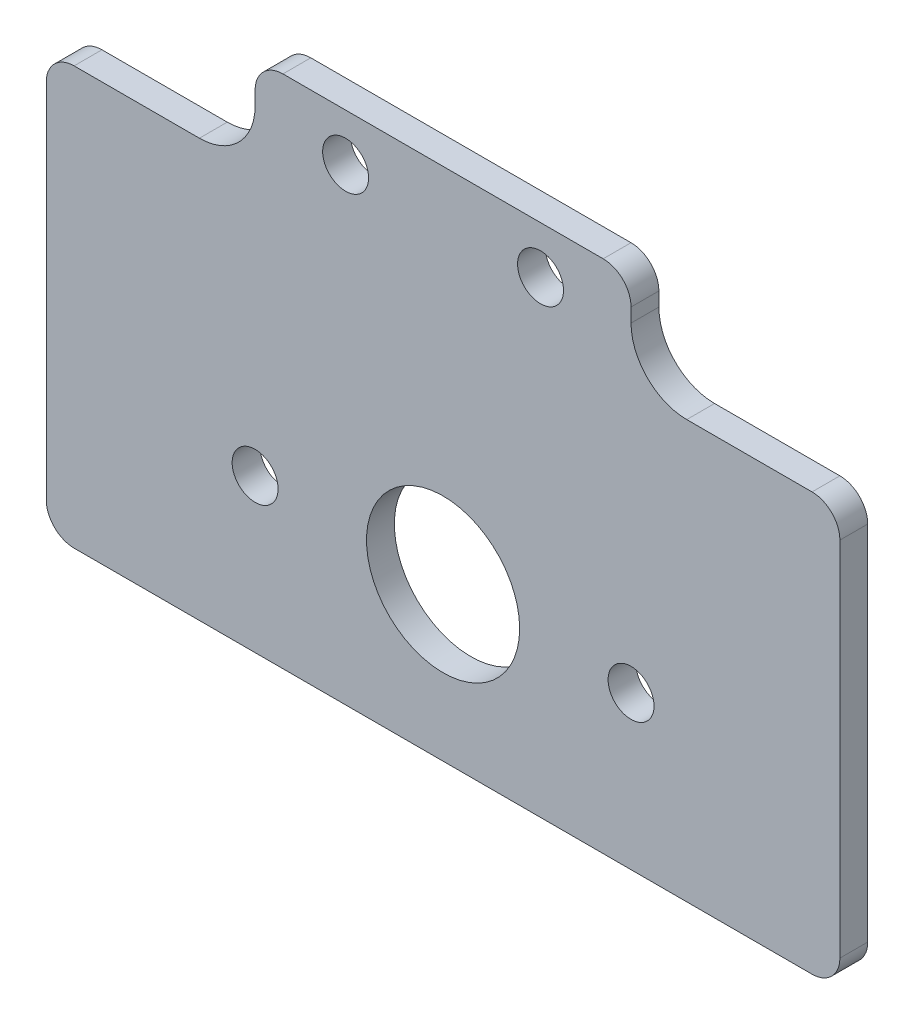
ISO-10303-21;
HEADER;
FILE_DESCRIPTION(('STEP AP214'),'2;1');
FILE_NAME('part.step','',(''),(''),'','','');
FILE_SCHEMA(('AUTOMOTIVE_DESIGN { 1 0 10303 214 1 1 1 1 }'));
ENDSEC;
DATA;
#1=APPLICATION_CONTEXT('core data for automotive mechanical design processes');
#2=APPLICATION_PROTOCOL_DEFINITION('international standard','automotive_design',2000,#1);
#3=PRODUCT_CONTEXT('',#1,'mechanical');
#4=PRODUCT('Part','Part','',(#3));
#5=PRODUCT_RELATED_PRODUCT_CATEGORY('part','',(#4));
#6=PRODUCT_DEFINITION_FORMATION('','',#4);
#7=PRODUCT_DEFINITION_CONTEXT('part definition',#1,'design');
#8=PRODUCT_DEFINITION('design','',#6,#7);
#9=PRODUCT_DEFINITION_SHAPE('','',#8);
#10=(LENGTH_UNIT() NAMED_UNIT(*) SI_UNIT(.MILLI.,.METRE.));
#11=(NAMED_UNIT(*) PLANE_ANGLE_UNIT() SI_UNIT($,.RADIAN.));
#12=(NAMED_UNIT(*) SI_UNIT($,.STERADIAN.) SOLID_ANGLE_UNIT());
#13=UNCERTAINTY_MEASURE_WITH_UNIT(LENGTH_MEASURE(1.E-05),#10,'distance_accuracy_value','');
#14=(GEOMETRIC_REPRESENTATION_CONTEXT(3) GLOBAL_UNCERTAINTY_ASSIGNED_CONTEXT((#13)) GLOBAL_UNIT_ASSIGNED_CONTEXT((#10,
#11,#12)) REPRESENTATION_CONTEXT('',''));
#15=CARTESIAN_POINT('',(0.,0.,0.));
#16=DIRECTION('',(0.,0.,1.));
#17=DIRECTION('',(1.,0.,0.));
#18=AXIS2_PLACEMENT_3D('',#15,#16,#17);
#19=CARTESIAN_POINT('',(142.5,86.9148936170212,10.));
#20=DIRECTION('',(0.,0.,1.));
#21=DIRECTION('',(1.,0.,0.));
#22=AXIS2_PLACEMENT_3D('',#19,#20,#21);
#23=PLANE('',#22);
#24=CARTESIAN_POINT('',(210.,55.,10.));
#25=DIRECTION('',(0.,0.,1.));
#26=DIRECTION('',(1.,0.,0.));
#27=AXIS2_PLACEMENT_3D('',#24,#25,#26);
#28=CIRCLE('',#27,8.25);
#29=CARTESIAN_POINT('',(218.25,55.,10.));
#30=VERTEX_POINT('',#29);
#31=EDGE_CURVE('E222',#30,#30,#28,.F.);
#32=ORIENTED_EDGE('',*,*,#31,.T.);
#33=EDGE_LOOP('',(#32));
#34=FACE_BOUND('',#33,.T.);
#35=CARTESIAN_POINT('',(177.5,168.,10.));
#36=DIRECTION('',(0.,0.,1.));
#37=DIRECTION('',(1.,0.,0.));
#38=AXIS2_PLACEMENT_3D('',#35,#36,#37);
#39=CIRCLE('',#38,8.25);
#40=CARTESIAN_POINT('',(185.75,168.,10.));
#41=VERTEX_POINT('',#40);
#42=EDGE_CURVE('E225',#41,#41,#39,.F.);
#43=ORIENTED_EDGE('',*,*,#42,.T.);
#44=EDGE_LOOP('',(#43));
#45=FACE_BOUND('',#44,.T.);
#46=CARTESIAN_POINT('',(107.5,168.,10.));
#47=DIRECTION('',(0.,0.,1.));
#48=DIRECTION('',(1.,0.,0.));
#49=AXIS2_PLACEMENT_3D('',#46,#47,#48);
#50=CIRCLE('',#49,8.25);
#51=CARTESIAN_POINT('',(115.75,168.,10.));
#52=VERTEX_POINT('',#51);
#53=EDGE_CURVE('E228',#52,#52,#50,.F.);
#54=ORIENTED_EDGE('',*,*,#53,.T.);
#55=EDGE_LOOP('',(#54));
#56=FACE_BOUND('',#55,.T.);
#57=CARTESIAN_POINT('',(75.,55.,10.));
#58=DIRECTION('',(0.,0.,1.));
#59=DIRECTION('',(1.,0.,0.));
#60=AXIS2_PLACEMENT_3D('',#57,#58,#59);
#61=CIRCLE('',#60,8.25);
#62=CARTESIAN_POINT('',(83.25,55.,10.));
#63=VERTEX_POINT('',#62);
#64=EDGE_CURVE('E231',#63,#63,#61,.F.);
#65=ORIENTED_EDGE('',*,*,#64,.T.);
#66=EDGE_LOOP('',(#65));
#67=FACE_BOUND('',#66,.T.);
#68=CARTESIAN_POINT('',(142.5,55.,10.));
#69=DIRECTION('',(0.,0.,1.));
#70=DIRECTION('',(1.,0.,0.));
#71=AXIS2_PLACEMENT_3D('',#68,#69,#70);
#72=CIRCLE('',#71,27.5);
#73=CARTESIAN_POINT('',(170.,55.,10.));
#74=VERTEX_POINT('',#73);
#75=EDGE_CURVE('E234',#74,#74,#72,.F.);
#76=ORIENTED_EDGE('',*,*,#75,.T.);
#77=EDGE_LOOP('',(#76));
#78=FACE_BOUND('',#77,.T.);
#79=CARTESIAN_POINT('',(10.,140.,10.));
#80=DIRECTION('',(0.,0.,1.));
#81=DIRECTION('',(1.,0.,0.));
#82=AXIS2_PLACEMENT_3D('',#79,#80,#81);
#83=CIRCLE('',#82,10.);
#84=CARTESIAN_POINT('',(0.,140.,10.));
#85=VERTEX_POINT('',#84);
#86=CARTESIAN_POINT('',(10.,150.,10.));
#87=VERTEX_POINT('',#86);
#88=EDGE_CURVE('E239',#85,#87,#83,.F.);
#89=ORIENTED_EDGE('',*,*,#88,.F.);
#90=DIRECTION('',(0.,1.,0.));
#91=VECTOR('',#90,1.);
#92=CARTESIAN_POINT('',(0.,150.,10.));
#93=LINE('',#92,#91);
#94=CARTESIAN_POINT('',(0.,10.,10.));
#95=VERTEX_POINT('',#94);
#96=EDGE_CURVE('E154',#95,#85,#93,.T.);
#97=ORIENTED_EDGE('',*,*,#96,.F.);
#98=CARTESIAN_POINT('',(10.,10.,10.));
#99=DIRECTION('',(0.,0.,1.));
#100=DIRECTION('',(1.,0.,0.));
#101=AXIS2_PLACEMENT_3D('',#98,#99,#100);
#102=CIRCLE('',#101,10.);
#103=CARTESIAN_POINT('',(10.,0.,10.));
#104=VERTEX_POINT('',#103);
#105=EDGE_CURVE('E141',#104,#95,#102,.F.);
#106=ORIENTED_EDGE('',*,*,#105,.F.);
#107=DIRECTION('',(1.,0.,0.));
#108=VECTOR('',#107,1.);
#109=CARTESIAN_POINT('',(0.,0.,10.));
#110=LINE('',#109,#108);
#111=CARTESIAN_POINT('',(275.,0.,10.));
#112=VERTEX_POINT('',#111);
#113=EDGE_CURVE('E137',#112,#104,#110,.F.);
#114=ORIENTED_EDGE('',*,*,#113,.F.);
#115=CARTESIAN_POINT('',(275.,10.,10.));
#116=DIRECTION('',(0.,0.,1.));
#117=DIRECTION('',(1.,0.,0.));
#118=AXIS2_PLACEMENT_3D('',#115,#116,#117);
#119=CIRCLE('',#118,10.);
#120=CARTESIAN_POINT('',(285.,10.,10.));
#121=VERTEX_POINT('',#120);
#122=EDGE_CURVE('E20',#121,#112,#119,.F.);
#123=ORIENTED_EDGE('',*,*,#122,.F.);
#124=DIRECTION('',(0.,1.,0.));
#125=VECTOR('',#124,1.);
#126=CARTESIAN_POINT('',(285.,0.,10.));
#127=LINE('',#126,#125);
#128=CARTESIAN_POINT('',(285.,140.,10.));
#129=VERTEX_POINT('',#128);
#130=EDGE_CURVE('E150',#129,#121,#127,.F.);
#131=ORIENTED_EDGE('',*,*,#130,.F.);
#132=CARTESIAN_POINT('',(275.,140.,10.));
#133=DIRECTION('',(0.,0.,1.));
#134=DIRECTION('',(1.,0.,0.));
#135=AXIS2_PLACEMENT_3D('',#132,#133,#134);
#136=CIRCLE('',#135,10.);
#137=CARTESIAN_POINT('',(275.,150.,10.));
#138=VERTEX_POINT('',#137);
#139=EDGE_CURVE('E180',#138,#129,#136,.F.);
#140=ORIENTED_EDGE('',*,*,#139,.F.);
#141=DIRECTION('',(-1.,0.,0.));
#142=VECTOR('',#141,1.);
#143=CARTESIAN_POINT('',(285.,150.,10.));
#144=LINE('',#143,#142);
#145=CARTESIAN_POINT('',(230.,150.,10.));
#146=VERTEX_POINT('',#145);
#147=EDGE_CURVE('E175',#146,#138,#144,.F.);
#148=ORIENTED_EDGE('',*,*,#147,.F.);
#149=CARTESIAN_POINT('',(230.,170.,10.));
#150=DIRECTION('',(0.,0.,1.));
#151=DIRECTION('',(1.,0.,0.));
#152=AXIS2_PLACEMENT_3D('',#149,#150,#151);
#153=CIRCLE('',#152,20.);
#154=CARTESIAN_POINT('',(210.,170.,10.));
#155=VERTEX_POINT('',#154);
#156=EDGE_CURVE('E174',#146,#155,#153,.F.);
#157=ORIENTED_EDGE('',*,*,#156,.T.);
#158=DIRECTION('',(0.,1.,0.));
#159=VECTOR('',#158,1.);
#160=CARTESIAN_POINT('',(210.,150.,10.));
#161=LINE('',#160,#159);
#162=CARTESIAN_POINT('',(210.,175.,10.));
#163=VERTEX_POINT('',#162);
#164=EDGE_CURVE('E171',#163,#155,#161,.F.);
#165=ORIENTED_EDGE('',*,*,#164,.F.);
#166=CARTESIAN_POINT('',(200.,175.,10.));
#167=DIRECTION('',(0.,0.,1.));
#168=DIRECTION('',(1.,0.,0.));
#169=AXIS2_PLACEMENT_3D('',#166,#167,#168);
#170=CIRCLE('',#169,10.);
#171=CARTESIAN_POINT('',(200.,185.,10.));
#172=VERTEX_POINT('',#171);
#173=EDGE_CURVE('E246',#172,#163,#170,.F.);
#174=ORIENTED_EDGE('',*,*,#173,.F.);
#175=DIRECTION('',(-1.,0.,0.));
#176=VECTOR('',#175,1.);
#177=CARTESIAN_POINT('',(210.,185.,10.));
#178=LINE('',#177,#176);
#179=CARTESIAN_POINT('',(85.,185.,10.));
#180=VERTEX_POINT('',#179);
#181=EDGE_CURVE('E167',#180,#172,#178,.F.);
#182=ORIENTED_EDGE('',*,*,#181,.F.);
#183=CARTESIAN_POINT('',(85.,175.,10.));
#184=DIRECTION('',(0.,0.,1.));
#185=DIRECTION('',(1.,0.,0.));
#186=AXIS2_PLACEMENT_3D('',#183,#184,#185);
#187=CIRCLE('',#186,10.);
#188=CARTESIAN_POINT('',(75.,175.,10.));
#189=VERTEX_POINT('',#188);
#190=EDGE_CURVE('E243',#189,#180,#187,.F.);
#191=ORIENTED_EDGE('',*,*,#190,.F.);
#192=DIRECTION('',(0.,-1.,0.));
#193=VECTOR('',#192,1.);
#194=CARTESIAN_POINT('',(75.,185.,10.));
#195=LINE('',#194,#193);
#196=CARTESIAN_POINT('',(75.,170.,10.));
#197=VERTEX_POINT('',#196);
#198=EDGE_CURVE('E162',#197,#189,#195,.F.);
#199=ORIENTED_EDGE('',*,*,#198,.F.);
#200=CARTESIAN_POINT('',(55.,170.,10.));
#201=DIRECTION('',(0.,0.,1.));
#202=DIRECTION('',(1.,0.,0.));
#203=AXIS2_PLACEMENT_3D('',#200,#201,#202);
#204=CIRCLE('',#203,20.);
#205=CARTESIAN_POINT('',(55.,150.,10.));
#206=VERTEX_POINT('',#205);
#207=EDGE_CURVE('E161',#197,#206,#204,.F.);
#208=ORIENTED_EDGE('',*,*,#207,.T.);
#209=DIRECTION('',(-1.,0.,0.));
#210=VECTOR('',#209,1.);
#211=CARTESIAN_POINT('',(75.,150.,10.));
#212=LINE('',#211,#210);
#213=EDGE_CURVE('E158',#87,#206,#212,.F.);
#214=ORIENTED_EDGE('',*,*,#213,.F.);
#215=EDGE_LOOP('',(#89,#97,#106,#114,#123,#131,#140,#148,#157,#165,#174,#182,#191,#199,#208,#214));
#216=FACE_BOUND('',#215,.T.);
#217=ADVANCED_FACE('F17',(#34,#45,#56,#67,#78,#216),#23,.T.);
#218=CARTESIAN_POINT('',(0.,0.,0.));
#219=DIRECTION('',(0.,-1.,0.));
#220=DIRECTION('',(0.,0.,-1.));
#221=AXIS2_PLACEMENT_3D('',#218,#219,#220);
#222=PLANE('',#221);
#223=DIRECTION('',(0.,0.,1.));
#224=VECTOR('',#223,1.);
#225=CARTESIAN_POINT('',(275.,0.,0.));
#226=LINE('',#225,#224);
#227=CARTESIAN_POINT('',(275.,0.,0.));
#228=VERTEX_POINT('',#227);
#229=EDGE_CURVE('E134',#112,#228,#226,.F.);
#230=ORIENTED_EDGE('',*,*,#229,.F.);
#231=ORIENTED_EDGE('',*,*,#113,.T.);
#232=DIRECTION('',(0.,0.,1.));
#233=VECTOR('',#232,1.);
#234=CARTESIAN_POINT('',(10.,0.,0.));
#235=LINE('',#234,#233);
#236=CARTESIAN_POINT('',(10.,0.,0.));
#237=VERTEX_POINT('',#236);
#238=EDGE_CURVE('E237',#237,#104,#235,.T.);
#239=ORIENTED_EDGE('',*,*,#238,.F.);
#240=DIRECTION('',(1.,0.,0.));
#241=VECTOR('',#240,1.);
#242=CARTESIAN_POINT('',(142.5,0.,0.));
#243=LINE('',#242,#241);
#244=EDGE_CURVE('E148',#237,#228,#243,.T.);
#245=ORIENTED_EDGE('',*,*,#244,.T.);
#246=EDGE_LOOP('',(#230,#231,#239,#245));
#247=FACE_BOUND('',#246,.T.);
#248=ADVANCED_FACE('F147',(#247),#222,.T.);
#249=CARTESIAN_POINT('',(275.,10.,0.));
#250=DIRECTION('',(0.,0.,1.));
#251=DIRECTION('',(1.,0.,0.));
#252=AXIS2_PLACEMENT_3D('',#249,#250,#251);
#253=CYLINDRICAL_SURFACE('',#252,10.);
#254=CARTESIAN_POINT('',(275.,10.,0.));
#255=DIRECTION('',(0.,0.,1.));
#256=DIRECTION('',(1.,0.,0.));
#257=AXIS2_PLACEMENT_3D('',#254,#255,#256);
#258=CIRCLE('',#257,10.);
#259=CARTESIAN_POINT('',(285.,10.,0.));
#260=VERTEX_POINT('',#259);
#261=EDGE_CURVE('E220',#228,#260,#258,.T.);
#262=ORIENTED_EDGE('',*,*,#261,.T.);
#263=DIRECTION('',(0.,0.,-1.));
#264=VECTOR('',#263,1.);
#265=CARTESIAN_POINT('',(285.,10.,0.));
#266=LINE('',#265,#264);
#267=EDGE_CURVE('E136',#121,#260,#266,.T.);
#268=ORIENTED_EDGE('',*,*,#267,.F.);
#269=ORIENTED_EDGE('',*,*,#122,.T.);
#270=ORIENTED_EDGE('',*,*,#229,.T.);
#271=EDGE_LOOP('',(#262,#268,#269,#270));
#272=FACE_BOUND('',#271,.T.);
#273=ADVANCED_FACE('F132',(#272),#253,.T.);
#274=CARTESIAN_POINT('',(285.,0.,0.));
#275=DIRECTION('',(1.,0.,0.));
#276=DIRECTION('',(0.,0.,-1.));
#277=AXIS2_PLACEMENT_3D('',#274,#275,#276);
#278=PLANE('',#277);
#279=DIRECTION('',(0.,0.,1.));
#280=VECTOR('',#279,1.);
#281=CARTESIAN_POINT('',(285.,140.,0.));
#282=LINE('',#281,#280);
#283=CARTESIAN_POINT('',(285.,140.,0.));
#284=VERTEX_POINT('',#283);
#285=EDGE_CURVE('E249',#129,#284,#282,.F.);
#286=ORIENTED_EDGE('',*,*,#285,.F.);
#287=ORIENTED_EDGE('',*,*,#130,.T.);
#288=ORIENTED_EDGE('',*,*,#267,.T.);
#289=DIRECTION('',(0.,1.,0.));
#290=VECTOR('',#289,1.);
#291=CARTESIAN_POINT('',(285.,86.9148936170212,0.));
#292=LINE('',#291,#290);
#293=EDGE_CURVE('E219',#260,#284,#292,.T.);
#294=ORIENTED_EDGE('',*,*,#293,.T.);
#295=EDGE_LOOP('',(#286,#287,#288,#294));
#296=FACE_BOUND('',#295,.T.);
#297=ADVANCED_FACE('F336',(#296),#278,.T.);
#298=CARTESIAN_POINT('',(275.,140.,0.));
#299=DIRECTION('',(0.,0.,1.));
#300=DIRECTION('',(1.,0.,0.));
#301=AXIS2_PLACEMENT_3D('',#298,#299,#300);
#302=CYLINDRICAL_SURFACE('',#301,10.);
#303=CARTESIAN_POINT('',(275.,140.,0.));
#304=DIRECTION('',(0.,0.,1.));
#305=DIRECTION('',(1.,0.,0.));
#306=AXIS2_PLACEMENT_3D('',#303,#304,#305);
#307=CIRCLE('',#306,10.);
#308=CARTESIAN_POINT('',(275.,150.,0.));
#309=VERTEX_POINT('',#308);
#310=EDGE_CURVE('E216',#284,#309,#307,.T.);
#311=ORIENTED_EDGE('',*,*,#310,.T.);
#312=DIRECTION('',(0.,0.,1.));
#313=VECTOR('',#312,1.);
#314=CARTESIAN_POINT('',(275.,150.,0.));
#315=LINE('',#314,#313);
#316=EDGE_CURVE('E179',#138,#309,#315,.F.);
#317=ORIENTED_EDGE('',*,*,#316,.F.);
#318=ORIENTED_EDGE('',*,*,#139,.T.);
#319=ORIENTED_EDGE('',*,*,#285,.T.);
#320=EDGE_LOOP('',(#311,#317,#318,#319));
#321=FACE_BOUND('',#320,.T.);
#322=ADVANCED_FACE('F334',(#321),#302,.T.);
#323=CARTESIAN_POINT('',(285.,150.,0.));
#324=DIRECTION('',(0.,1.,0.));
#325=DIRECTION('',(-1.,0.,0.));
#326=AXIS2_PLACEMENT_3D('',#323,#324,#325);
#327=PLANE('',#326);
#328=DIRECTION('',(0.,0.,1.));
#329=VECTOR('',#328,1.);
#330=CARTESIAN_POINT('',(230.,150.,0.));
#331=LINE('',#330,#329);
#332=CARTESIAN_POINT('',(230.,150.,0.));
#333=VERTEX_POINT('',#332);
#334=EDGE_CURVE('E178',#333,#146,#331,.T.);
#335=ORIENTED_EDGE('',*,*,#334,.T.);
#336=ORIENTED_EDGE('',*,*,#147,.T.);
#337=ORIENTED_EDGE('',*,*,#316,.T.);
#338=DIRECTION('',(1.,0.,0.));
#339=VECTOR('',#338,1.);
#340=CARTESIAN_POINT('',(142.5,150.,0.));
#341=LINE('',#340,#339);
#342=EDGE_CURVE('E215',#309,#333,#341,.F.);
#343=ORIENTED_EDGE('',*,*,#342,.T.);
#344=EDGE_LOOP('',(#335,#336,#337,#343));
#345=FACE_BOUND('',#344,.T.);
#346=ADVANCED_FACE('F332',(#345),#327,.T.);
#347=CARTESIAN_POINT('',(230.,170.,0.));
#348=DIRECTION('',(0.,0.,1.));
#349=DIRECTION('',(1.,0.,0.));
#350=AXIS2_PLACEMENT_3D('',#347,#348,#349);
#351=CYLINDRICAL_SURFACE('',#350,20.);
#352=DIRECTION('',(0.,0.,-1.));
#353=VECTOR('',#352,1.);
#354=CARTESIAN_POINT('',(210.,170.,0.));
#355=LINE('',#354,#353);
#356=CARTESIAN_POINT('',(210.,170.,0.));
#357=VERTEX_POINT('',#356);
#358=EDGE_CURVE('E173',#155,#357,#355,.T.);
#359=ORIENTED_EDGE('',*,*,#358,.F.);
#360=ORIENTED_EDGE('',*,*,#156,.F.);
#361=ORIENTED_EDGE('',*,*,#334,.F.);
#362=CARTESIAN_POINT('',(230.,170.,0.));
#363=DIRECTION('',(0.,0.,1.));
#364=DIRECTION('',(1.,0.,0.));
#365=AXIS2_PLACEMENT_3D('',#362,#363,#364);
#366=CIRCLE('',#365,20.);
#367=EDGE_CURVE('E212',#333,#357,#366,.F.);
#368=ORIENTED_EDGE('',*,*,#367,.T.);
#369=EDGE_LOOP('',(#359,#360,#361,#368));
#370=FACE_BOUND('',#369,.T.);
#371=ADVANCED_FACE('F329',(#370),#351,.F.);
#372=CARTESIAN_POINT('',(210.,150.,0.));
#373=DIRECTION('',(1.,0.,0.));
#374=DIRECTION('',(0.,0.,-1.));
#375=AXIS2_PLACEMENT_3D('',#372,#373,#374);
#376=PLANE('',#375);
#377=ORIENTED_EDGE('',*,*,#358,.T.);
#378=DIRECTION('',(0.,1.,0.));
#379=VECTOR('',#378,1.);
#380=CARTESIAN_POINT('',(210.,86.9148936170212,0.));
#381=LINE('',#380,#379);
#382=CARTESIAN_POINT('',(210.,175.,0.));
#383=VERTEX_POINT('',#382);
#384=EDGE_CURVE('E211',#357,#383,#381,.T.);
#385=ORIENTED_EDGE('',*,*,#384,.T.);
#386=DIRECTION('',(0.,0.,1.));
#387=VECTOR('',#386,1.);
#388=CARTESIAN_POINT('',(210.,175.,0.));
#389=LINE('',#388,#387);
#390=EDGE_CURVE('E170',#163,#383,#389,.F.);
#391=ORIENTED_EDGE('',*,*,#390,.F.);
#392=ORIENTED_EDGE('',*,*,#164,.T.);
#393=EDGE_LOOP('',(#377,#385,#391,#392));
#394=FACE_BOUND('',#393,.T.);
#395=ADVANCED_FACE('F324',(#394),#376,.T.);
#396=CARTESIAN_POINT('',(200.,175.,0.));
#397=DIRECTION('',(0.,0.,1.));
#398=DIRECTION('',(1.,0.,0.));
#399=AXIS2_PLACEMENT_3D('',#396,#397,#398);
#400=CYLINDRICAL_SURFACE('',#399,10.);
#401=CARTESIAN_POINT('',(200.,175.,0.));
#402=DIRECTION('',(0.,0.,1.));
#403=DIRECTION('',(1.,0.,0.));
#404=AXIS2_PLACEMENT_3D('',#401,#402,#403);
#405=CIRCLE('',#404,10.);
#406=CARTESIAN_POINT('',(200.,185.,0.));
#407=VERTEX_POINT('',#406);
#408=EDGE_CURVE('E208',#383,#407,#405,.T.);
#409=ORIENTED_EDGE('',*,*,#408,.T.);
#410=DIRECTION('',(0.,0.,1.));
#411=VECTOR('',#410,1.);
#412=CARTESIAN_POINT('',(200.,185.,0.));
#413=LINE('',#412,#411);
#414=EDGE_CURVE('E169',#172,#407,#413,.F.);
#415=ORIENTED_EDGE('',*,*,#414,.F.);
#416=ORIENTED_EDGE('',*,*,#173,.T.);
#417=ORIENTED_EDGE('',*,*,#390,.T.);
#418=EDGE_LOOP('',(#409,#415,#416,#417));
#419=FACE_BOUND('',#418,.T.);
#420=ADVANCED_FACE('F320',(#419),#400,.T.);
#421=CARTESIAN_POINT('',(210.,185.,0.));
#422=DIRECTION('',(0.,1.,0.));
#423=DIRECTION('',(-1.,0.,0.));
#424=AXIS2_PLACEMENT_3D('',#421,#422,#423);
#425=PLANE('',#424);
#426=ORIENTED_EDGE('',*,*,#414,.T.);
#427=DIRECTION('',(1.,0.,0.));
#428=VECTOR('',#427,1.);
#429=CARTESIAN_POINT('',(142.5,185.,0.));
#430=LINE('',#429,#428);
#431=CARTESIAN_POINT('',(85.,185.,0.));
#432=VERTEX_POINT('',#431);
#433=EDGE_CURVE('E207',#407,#432,#430,.F.);
#434=ORIENTED_EDGE('',*,*,#433,.T.);
#435=DIRECTION('',(0.,0.,1.));
#436=VECTOR('',#435,1.);
#437=CARTESIAN_POINT('',(85.,185.,0.));
#438=LINE('',#437,#436);
#439=EDGE_CURVE('E245',#180,#432,#438,.F.);
#440=ORIENTED_EDGE('',*,*,#439,.F.);
#441=ORIENTED_EDGE('',*,*,#181,.T.);
#442=EDGE_LOOP('',(#426,#434,#440,#441));
#443=FACE_BOUND('',#442,.T.);
#444=ADVANCED_FACE('F314',(#443),#425,.T.);
#445=CARTESIAN_POINT('',(85.,175.,0.));
#446=DIRECTION('',(0.,0.,1.));
#447=DIRECTION('',(1.,0.,0.));
#448=AXIS2_PLACEMENT_3D('',#445,#446,#447);
#449=CYLINDRICAL_SURFACE('',#448,10.);
#450=CARTESIAN_POINT('',(85.,175.,0.));
#451=DIRECTION('',(0.,0.,1.));
#452=DIRECTION('',(1.,0.,0.));
#453=AXIS2_PLACEMENT_3D('',#450,#451,#452);
#454=CIRCLE('',#453,10.);
#455=CARTESIAN_POINT('',(75.,175.,0.));
#456=VERTEX_POINT('',#455);
#457=EDGE_CURVE('E204',#432,#456,#454,.T.);
#458=ORIENTED_EDGE('',*,*,#457,.T.);
#459=DIRECTION('',(0.,0.,1.));
#460=VECTOR('',#459,1.);
#461=CARTESIAN_POINT('',(75.,175.,0.));
#462=LINE('',#461,#460);
#463=EDGE_CURVE('E166',#189,#456,#462,.F.);
#464=ORIENTED_EDGE('',*,*,#463,.F.);
#465=ORIENTED_EDGE('',*,*,#190,.T.);
#466=ORIENTED_EDGE('',*,*,#439,.T.);
#467=EDGE_LOOP('',(#458,#464,#465,#466));
#468=FACE_BOUND('',#467,.T.);
#469=ADVANCED_FACE('F310',(#468),#449,.T.);
#470=CARTESIAN_POINT('',(75.,185.,0.));
#471=DIRECTION('',(-1.,0.,0.));
#472=DIRECTION('',(0.,-1.,0.));
#473=AXIS2_PLACEMENT_3D('',#470,#471,#472);
#474=PLANE('',#473);
#475=DIRECTION('',(0.,0.,1.));
#476=VECTOR('',#475,1.);
#477=CARTESIAN_POINT('',(75.,170.,0.));
#478=LINE('',#477,#476);
#479=CARTESIAN_POINT('',(75.,170.,0.));
#480=VERTEX_POINT('',#479);
#481=EDGE_CURVE('E165',#480,#197,#478,.T.);
#482=ORIENTED_EDGE('',*,*,#481,.T.);
#483=ORIENTED_EDGE('',*,*,#198,.T.);
#484=ORIENTED_EDGE('',*,*,#463,.T.);
#485=DIRECTION('',(0.,1.,0.));
#486=VECTOR('',#485,1.);
#487=CARTESIAN_POINT('',(75.,86.9148936170212,0.));
#488=LINE('',#487,#486);
#489=EDGE_CURVE('E203',#456,#480,#488,.F.);
#490=ORIENTED_EDGE('',*,*,#489,.T.);
#491=EDGE_LOOP('',(#482,#483,#484,#490));
#492=FACE_BOUND('',#491,.T.);
#493=ADVANCED_FACE('F305',(#492),#474,.T.);
#494=CARTESIAN_POINT('',(55.,170.,0.));
#495=DIRECTION('',(0.,0.,1.));
#496=DIRECTION('',(1.,0.,0.));
#497=AXIS2_PLACEMENT_3D('',#494,#495,#496);
#498=CYLINDRICAL_SURFACE('',#497,20.);
#499=DIRECTION('',(0.,0.,1.));
#500=VECTOR('',#499,1.);
#501=CARTESIAN_POINT('',(55.,150.,0.));
#502=LINE('',#501,#500);
#503=CARTESIAN_POINT('',(55.,150.,0.));
#504=VERTEX_POINT('',#503);
#505=EDGE_CURVE('E160',#206,#504,#502,.F.);
#506=ORIENTED_EDGE('',*,*,#505,.F.);
#507=ORIENTED_EDGE('',*,*,#207,.F.);
#508=ORIENTED_EDGE('',*,*,#481,.F.);
#509=CARTESIAN_POINT('',(55.,170.,0.));
#510=DIRECTION('',(0.,0.,1.));
#511=DIRECTION('',(1.,0.,0.));
#512=AXIS2_PLACEMENT_3D('',#509,#510,#511);
#513=CIRCLE('',#512,20.);
#514=EDGE_CURVE('E200',#480,#504,#513,.F.);
#515=ORIENTED_EDGE('',*,*,#514,.T.);
#516=EDGE_LOOP('',(#506,#507,#508,#515));
#517=FACE_BOUND('',#516,.T.);
#518=ADVANCED_FACE('F302',(#517),#498,.F.);
#519=CARTESIAN_POINT('',(75.,150.,0.));
#520=DIRECTION('',(0.,1.,0.));
#521=DIRECTION('',(-1.,0.,0.));
#522=AXIS2_PLACEMENT_3D('',#519,#520,#521);
#523=PLANE('',#522);
#524=ORIENTED_EDGE('',*,*,#505,.T.);
#525=DIRECTION('',(1.,0.,0.));
#526=VECTOR('',#525,1.);
#527=CARTESIAN_POINT('',(142.5,150.,0.));
#528=LINE('',#527,#526);
#529=CARTESIAN_POINT('',(10.,150.,0.));
#530=VERTEX_POINT('',#529);
#531=EDGE_CURVE('E199',#504,#530,#528,.F.);
#532=ORIENTED_EDGE('',*,*,#531,.T.);
#533=DIRECTION('',(0.,0.,1.));
#534=VECTOR('',#533,1.);
#535=CARTESIAN_POINT('',(10.,150.,0.));
#536=LINE('',#535,#534);
#537=EDGE_CURVE('E157',#87,#530,#536,.F.);
#538=ORIENTED_EDGE('',*,*,#537,.F.);
#539=ORIENTED_EDGE('',*,*,#213,.T.);
#540=EDGE_LOOP('',(#524,#532,#538,#539));
#541=FACE_BOUND('',#540,.T.);
#542=ADVANCED_FACE('F297',(#541),#523,.T.);
#543=CARTESIAN_POINT('',(10.,140.,0.));
#544=DIRECTION('',(0.,0.,1.));
#545=DIRECTION('',(1.,0.,0.));
#546=AXIS2_PLACEMENT_3D('',#543,#544,#545);
#547=CYLINDRICAL_SURFACE('',#546,10.);
#548=CARTESIAN_POINT('',(10.,140.,0.));
#549=DIRECTION('',(0.,0.,1.));
#550=DIRECTION('',(1.,0.,0.));
#551=AXIS2_PLACEMENT_3D('',#548,#549,#550);
#552=CIRCLE('',#551,10.);
#553=CARTESIAN_POINT('',(0.,140.,0.));
#554=VERTEX_POINT('',#553);
#555=EDGE_CURVE('E196',#530,#554,#552,.T.);
#556=ORIENTED_EDGE('',*,*,#555,.T.);
#557=DIRECTION('',(0.,0.,1.));
#558=VECTOR('',#557,1.);
#559=CARTESIAN_POINT('',(0.,140.,0.));
#560=LINE('',#559,#558);
#561=EDGE_CURVE('E156',#85,#554,#560,.F.);
#562=ORIENTED_EDGE('',*,*,#561,.F.);
#563=ORIENTED_EDGE('',*,*,#88,.T.);
#564=ORIENTED_EDGE('',*,*,#537,.T.);
#565=EDGE_LOOP('',(#556,#562,#563,#564));
#566=FACE_BOUND('',#565,.T.);
#567=ADVANCED_FACE('F293',(#566),#547,.T.);
#568=CARTESIAN_POINT('',(0.,150.,0.));
#569=DIRECTION('',(-1.,0.,0.));
#570=DIRECTION('',(0.,0.,1.));
#571=AXIS2_PLACEMENT_3D('',#568,#569,#570);
#572=PLANE('',#571);
#573=ORIENTED_EDGE('',*,*,#561,.T.);
#574=DIRECTION('',(0.,1.,0.));
#575=VECTOR('',#574,1.);
#576=CARTESIAN_POINT('',(0.,86.9148936170212,0.));
#577=LINE('',#576,#575);
#578=CARTESIAN_POINT('',(0.,10.,0.));
#579=VERTEX_POINT('',#578);
#580=EDGE_CURVE('E195',#554,#579,#577,.F.);
#581=ORIENTED_EDGE('',*,*,#580,.T.);
#582=DIRECTION('',(0.,0.,1.));
#583=VECTOR('',#582,1.);
#584=CARTESIAN_POINT('',(0.,10.,0.));
#585=LINE('',#584,#583);
#586=EDGE_CURVE('E35',#95,#579,#585,.F.);
#587=ORIENTED_EDGE('',*,*,#586,.F.);
#588=ORIENTED_EDGE('',*,*,#96,.T.);
#589=EDGE_LOOP('',(#573,#581,#587,#588));
#590=FACE_BOUND('',#589,.T.);
#591=ADVANCED_FACE('F286',(#590),#572,.T.);
#592=CARTESIAN_POINT('',(10.,10.,0.));
#593=DIRECTION('',(0.,0.,1.));
#594=DIRECTION('',(1.,0.,0.));
#595=AXIS2_PLACEMENT_3D('',#592,#593,#594);
#596=CYLINDRICAL_SURFACE('',#595,10.);
#597=CARTESIAN_POINT('',(10.,10.,0.));
#598=DIRECTION('',(0.,0.,1.));
#599=DIRECTION('',(1.,0.,0.));
#600=AXIS2_PLACEMENT_3D('',#597,#598,#599);
#601=CIRCLE('',#600,10.);
#602=EDGE_CURVE('E193',#579,#237,#601,.T.);
#603=ORIENTED_EDGE('',*,*,#602,.T.);
#604=ORIENTED_EDGE('',*,*,#238,.T.);
#605=ORIENTED_EDGE('',*,*,#105,.T.);
#606=ORIENTED_EDGE('',*,*,#586,.T.);
#607=EDGE_LOOP('',(#603,#604,#605,#606));
#608=FACE_BOUND('',#607,.T.);
#609=ADVANCED_FACE('F373',(#608),#596,.T.);
#610=CARTESIAN_POINT('',(142.5,55.,-15.));
#611=DIRECTION('',(0.,0.,1.));
#612=DIRECTION('',(1.,0.,0.));
#613=AXIS2_PLACEMENT_3D('',#610,#611,#612);
#614=CYLINDRICAL_SURFACE('',#613,27.5);
#615=ORIENTED_EDGE('',*,*,#75,.F.);
#616=EDGE_LOOP('',(#615));
#617=FACE_BOUND('',#616,.T.);
#618=CARTESIAN_POINT('',(142.5,55.,0.));
#619=DIRECTION('',(0.,0.,1.));
#620=DIRECTION('',(1.,0.,0.));
#621=AXIS2_PLACEMENT_3D('',#618,#619,#620);
#622=CIRCLE('',#621,27.5);
#623=CARTESIAN_POINT('',(170.,55.,0.));
#624=VERTEX_POINT('',#623);
#625=EDGE_CURVE('E190',#624,#624,#622,.F.);
#626=ORIENTED_EDGE('',*,*,#625,.T.);
#627=EDGE_LOOP('',(#626));
#628=FACE_BOUND('',#627,.T.);
#629=ADVANCED_FACE('F369',(#617,#628),#614,.F.);
#630=CARTESIAN_POINT('',(75.,55.,-15.));
#631=DIRECTION('',(0.,0.,1.));
#632=DIRECTION('',(1.,0.,0.));
#633=AXIS2_PLACEMENT_3D('',#630,#631,#632);
#634=CYLINDRICAL_SURFACE('',#633,8.25);
#635=ORIENTED_EDGE('',*,*,#64,.F.);
#636=EDGE_LOOP('',(#635));
#637=FACE_BOUND('',#636,.T.);
#638=CARTESIAN_POINT('',(75.,55.,0.));
#639=DIRECTION('',(0.,0.,1.));
#640=DIRECTION('',(1.,0.,0.));
#641=AXIS2_PLACEMENT_3D('',#638,#639,#640);
#642=CIRCLE('',#641,8.25);
#643=CARTESIAN_POINT('',(83.25,55.,0.));
#644=VERTEX_POINT('',#643);
#645=EDGE_CURVE('E187',#644,#644,#642,.F.);
#646=ORIENTED_EDGE('',*,*,#645,.T.);
#647=EDGE_LOOP('',(#646));
#648=FACE_BOUND('',#647,.T.);
#649=ADVANCED_FACE('F365',(#637,#648),#634,.F.);
#650=CARTESIAN_POINT('',(107.5,168.,-15.));
#651=DIRECTION('',(0.,0.,1.));
#652=DIRECTION('',(1.,0.,0.));
#653=AXIS2_PLACEMENT_3D('',#650,#651,#652);
#654=CYLINDRICAL_SURFACE('',#653,8.25);
#655=ORIENTED_EDGE('',*,*,#53,.F.);
#656=EDGE_LOOP('',(#655));
#657=FACE_BOUND('',#656,.T.);
#658=CARTESIAN_POINT('',(107.5,168.,0.));
#659=DIRECTION('',(0.,0.,1.));
#660=DIRECTION('',(1.,0.,0.));
#661=AXIS2_PLACEMENT_3D('',#658,#659,#660);
#662=CIRCLE('',#661,8.25);
#663=CARTESIAN_POINT('',(115.75,168.,0.));
#664=VERTEX_POINT('',#663);
#665=EDGE_CURVE('E184',#664,#664,#662,.F.);
#666=ORIENTED_EDGE('',*,*,#665,.T.);
#667=EDGE_LOOP('',(#666));
#668=FACE_BOUND('',#667,.T.);
#669=ADVANCED_FACE('F361',(#657,#668),#654,.F.);
#670=CARTESIAN_POINT('',(177.5,168.,-15.));
#671=DIRECTION('',(0.,0.,1.));
#672=DIRECTION('',(1.,0.,0.));
#673=AXIS2_PLACEMENT_3D('',#670,#671,#672);
#674=CYLINDRICAL_SURFACE('',#673,8.25);
#675=ORIENTED_EDGE('',*,*,#42,.F.);
#676=EDGE_LOOP('',(#675));
#677=FACE_BOUND('',#676,.T.);
#678=CARTESIAN_POINT('',(177.5,168.,0.));
#679=DIRECTION('',(0.,0.,1.));
#680=DIRECTION('',(1.,0.,0.));
#681=AXIS2_PLACEMENT_3D('',#678,#679,#680);
#682=CIRCLE('',#681,8.25);
#683=CARTESIAN_POINT('',(185.75,168.,0.));
#684=VERTEX_POINT('',#683);
#685=EDGE_CURVE('E26',#684,#684,#682,.F.);
#686=ORIENTED_EDGE('',*,*,#685,.T.);
#687=EDGE_LOOP('',(#686));
#688=FACE_BOUND('',#687,.T.);
#689=ADVANCED_FACE('F353',(#677,#688),#674,.F.);
#690=CARTESIAN_POINT('',(210.,55.,-15.));
#691=DIRECTION('',(0.,0.,1.));
#692=DIRECTION('',(1.,0.,0.));
#693=AXIS2_PLACEMENT_3D('',#690,#691,#692);
#694=CYLINDRICAL_SURFACE('',#693,8.25);
#695=ORIENTED_EDGE('',*,*,#31,.F.);
#696=EDGE_LOOP('',(#695));
#697=FACE_BOUND('',#696,.T.);
#698=CARTESIAN_POINT('',(210.,55.,0.));
#699=DIRECTION('',(0.,0.,1.));
#700=DIRECTION('',(1.,0.,0.));
#701=AXIS2_PLACEMENT_3D('',#698,#699,#700);
#702=CIRCLE('',#701,8.25);
#703=CARTESIAN_POINT('',(218.25,55.,0.));
#704=VERTEX_POINT('',#703);
#705=EDGE_CURVE('E11',#704,#704,#702,.F.);
#706=ORIENTED_EDGE('',*,*,#705,.T.);
#707=EDGE_LOOP('',(#706));
#708=FACE_BOUND('',#707,.T.);
#709=ADVANCED_FACE('F347',(#697,#708),#694,.F.);
#710=CARTESIAN_POINT('',(142.5,86.9148936170212,0.));
#711=DIRECTION('',(0.,0.,1.));
#712=DIRECTION('',(1.,0.,0.));
#713=AXIS2_PLACEMENT_3D('',#710,#711,#712);
#714=PLANE('',#713);
#715=ORIENTED_EDGE('',*,*,#705,.F.);
#716=EDGE_LOOP('',(#715));
#717=FACE_BOUND('',#716,.T.);
#718=ORIENTED_EDGE('',*,*,#685,.F.);
#719=EDGE_LOOP('',(#718));
#720=FACE_BOUND('',#719,.T.);
#721=ORIENTED_EDGE('',*,*,#665,.F.);
#722=EDGE_LOOP('',(#721));
#723=FACE_BOUND('',#722,.T.);
#724=ORIENTED_EDGE('',*,*,#645,.F.);
#725=EDGE_LOOP('',(#724));
#726=FACE_BOUND('',#725,.T.);
#727=ORIENTED_EDGE('',*,*,#625,.F.);
#728=EDGE_LOOP('',(#727));
#729=FACE_BOUND('',#728,.T.);
#730=ORIENTED_EDGE('',*,*,#580,.F.);
#731=ORIENTED_EDGE('',*,*,#555,.F.);
#732=ORIENTED_EDGE('',*,*,#531,.F.);
#733=ORIENTED_EDGE('',*,*,#514,.F.);
#734=ORIENTED_EDGE('',*,*,#489,.F.);
#735=ORIENTED_EDGE('',*,*,#457,.F.);
#736=ORIENTED_EDGE('',*,*,#433,.F.);
#737=ORIENTED_EDGE('',*,*,#408,.F.);
#738=ORIENTED_EDGE('',*,*,#384,.F.);
#739=ORIENTED_EDGE('',*,*,#367,.F.);
#740=ORIENTED_EDGE('',*,*,#342,.F.);
#741=ORIENTED_EDGE('',*,*,#310,.F.);
#742=ORIENTED_EDGE('',*,*,#293,.F.);
#743=ORIENTED_EDGE('',*,*,#261,.F.);
#744=ORIENTED_EDGE('',*,*,#244,.F.);
#745=ORIENTED_EDGE('',*,*,#602,.F.);
#746=EDGE_LOOP('',(#730,#731,#732,#733,#734,#735,#736,#737,#738,#739,#740,#741,#742,#743,#744,#745));
#747=FACE_BOUND('',#746,.T.);
#748=ADVANCED_FACE('F290',(#717,#720,#723,#726,#729,#747),#714,.F.);
#749=CLOSED_SHELL('',(#217,#248,#273,#297,#322,#346,#371,#395,#420,#444,#469,#493,#518,#542,
#567,#591,#609,#629,#649,#669,#689,#709,#748));
#750=MANIFOLD_SOLID_BREP('B1',#749);
#751=ADVANCED_BREP_SHAPE_REPRESENTATION('',(#18,#750),#14);
#752=SHAPE_DEFINITION_REPRESENTATION(#9,#751);
ENDSEC;
END-ISO-10303-21;
